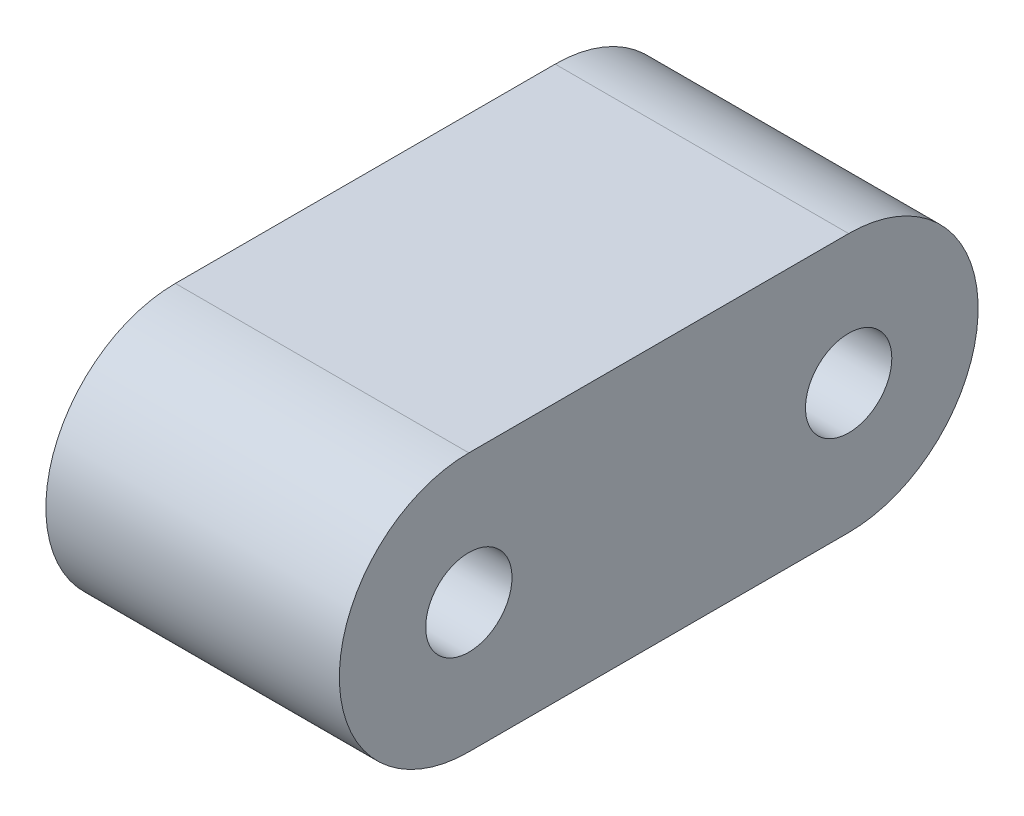
ISO-10303-21;
HEADER;
FILE_DESCRIPTION(('STEP AP214'),'2;1');
FILE_NAME('part.step','',(''),(''),'','','');
FILE_SCHEMA(('AUTOMOTIVE_DESIGN { 1 0 10303 214 1 1 1 1 }'));
ENDSEC;
DATA;
#1=APPLICATION_CONTEXT('core data for automotive mechanical design processes');
#2=APPLICATION_PROTOCOL_DEFINITION('international standard','automotive_design',2000,#1);
#3=PRODUCT_CONTEXT('',#1,'mechanical');
#4=PRODUCT('Part','Part','',(#3));
#5=PRODUCT_RELATED_PRODUCT_CATEGORY('part','',(#4));
#6=PRODUCT_DEFINITION_FORMATION('','',#4);
#7=PRODUCT_DEFINITION_CONTEXT('part definition',#1,'design');
#8=PRODUCT_DEFINITION('design','',#6,#7);
#9=PRODUCT_DEFINITION_SHAPE('','',#8);
#10=(LENGTH_UNIT() NAMED_UNIT(*) SI_UNIT(.MILLI.,.METRE.));
#11=(NAMED_UNIT(*) PLANE_ANGLE_UNIT() SI_UNIT($,.RADIAN.));
#12=(NAMED_UNIT(*) SI_UNIT($,.STERADIAN.) SOLID_ANGLE_UNIT());
#13=UNCERTAINTY_MEASURE_WITH_UNIT(LENGTH_MEASURE(1.E-05),#10,'distance_accuracy_value','');
#14=(GEOMETRIC_REPRESENTATION_CONTEXT(3) GLOBAL_UNCERTAINTY_ASSIGNED_CONTEXT((#13)) GLOBAL_UNIT_ASSIGNED_CONTEXT((#10,
#11,#12)) REPRESENTATION_CONTEXT('',''));
#15=CARTESIAN_POINT('',(0.,0.,0.));
#16=DIRECTION('',(0.,0.,1.));
#17=DIRECTION('',(1.,0.,0.));
#18=AXIS2_PLACEMENT_3D('',#15,#16,#17);
#19=CARTESIAN_POINT('',(8.5,0.,11.));
#20=DIRECTION('',(1.,0.,0.));
#21=DIRECTION('',(0.,0.,-1.));
#22=AXIS2_PLACEMENT_3D('',#19,#20,#21);
#23=PLANE('',#22);
#24=CARTESIAN_POINT('',(8.5,0.,11.));
#25=DIRECTION('',(1.,0.,0.));
#26=DIRECTION('',(0.,0.,-1.));
#27=AXIS2_PLACEMENT_3D('',#24,#25,#26);
#28=CIRCLE('',#27,2.5);
#29=CARTESIAN_POINT('',(8.5,0.,8.5));
#30=VERTEX_POINT('',#29);
#31=EDGE_CURVE('E102',#30,#30,#28,.T.);
#32=ORIENTED_EDGE('',*,*,#31,.F.);
#33=EDGE_LOOP('',(#32));
#34=FACE_BOUND('',#33,.T.);
#35=CARTESIAN_POINT('',(8.5,0.,11.));
#36=DIRECTION('',(1.,0.,0.));
#37=DIRECTION('',(0.,0.,-1.));
#38=AXIS2_PLACEMENT_3D('',#35,#36,#37);
#39=CIRCLE('',#38,7.49999999999999);
#40=CARTESIAN_POINT('',(8.5,7.49999999999999,11.));
#41=VERTEX_POINT('',#40);
#42=CARTESIAN_POINT('',(8.5,-7.5,11.));
#43=VERTEX_POINT('',#42);
#44=EDGE_CURVE('E87',#41,#43,#39,.T.);
#45=ORIENTED_EDGE('',*,*,#44,.T.);
#46=DIRECTION('',(0.,0.,-1.));
#47=VECTOR('',#46,1.);
#48=CARTESIAN_POINT('',(8.5,-7.5,11.));
#49=LINE('',#48,#47);
#50=CARTESIAN_POINT('',(8.5,-7.49999999999999,-11.));
#51=VERTEX_POINT('',#50);
#52=EDGE_CURVE('E82',#43,#51,#49,.T.);
#53=ORIENTED_EDGE('',*,*,#52,.T.);
#54=CARTESIAN_POINT('',(8.5,0.,-11.));
#55=DIRECTION('',(1.,0.,0.));
#56=DIRECTION('',(0.,0.,-1.));
#57=AXIS2_PLACEMENT_3D('',#54,#55,#56);
#58=CIRCLE('',#57,7.49999999999999);
#59=CARTESIAN_POINT('',(8.5,7.49999999999999,-11.));
#60=VERTEX_POINT('',#59);
#61=EDGE_CURVE('E85',#51,#60,#58,.T.);
#62=ORIENTED_EDGE('',*,*,#61,.T.);
#63=DIRECTION('',(0.,0.,1.));
#64=VECTOR('',#63,1.);
#65=CARTESIAN_POINT('',(8.5,7.49999999999999,11.));
#66=LINE('',#65,#64);
#67=EDGE_CURVE('E52',#60,#41,#66,.T.);
#68=ORIENTED_EDGE('',*,*,#67,.T.);
#69=EDGE_LOOP('',(#45,#53,#62,#68));
#70=FACE_BOUND('',#69,.T.);
#71=CARTESIAN_POINT('',(8.5,0.,-11.));
#72=DIRECTION('',(1.,0.,0.));
#73=DIRECTION('',(0.,0.,-1.));
#74=AXIS2_PLACEMENT_3D('',#71,#72,#73);
#75=CIRCLE('',#74,2.5);
#76=CARTESIAN_POINT('',(8.5,0.,-13.5));
#77=VERTEX_POINT('',#76);
#78=EDGE_CURVE('E117',#77,#77,#75,.T.);
#79=ORIENTED_EDGE('',*,*,#78,.F.);
#80=EDGE_LOOP('',(#79));
#81=FACE_BOUND('',#80,.T.);
#82=ADVANCED_FACE('F35',(#34,#70,#81),#23,.T.);
#83=CARTESIAN_POINT('',(-8.5,0.,11.));
#84=DIRECTION('',(1.,0.,0.));
#85=DIRECTION('',(0.,0.,-1.));
#86=AXIS2_PLACEMENT_3D('',#83,#84,#85);
#87=PLANE('',#86);
#88=CARTESIAN_POINT('',(-8.5,0.,11.));
#89=DIRECTION('',(1.,0.,0.));
#90=DIRECTION('',(0.,0.,-1.));
#91=AXIS2_PLACEMENT_3D('',#88,#89,#90);
#92=CIRCLE('',#91,7.49999999999999);
#93=CARTESIAN_POINT('',(-8.5,7.49999999999999,11.));
#94=VERTEX_POINT('',#93);
#95=CARTESIAN_POINT('',(-8.5,-7.5,11.));
#96=VERTEX_POINT('',#95);
#97=EDGE_CURVE('E99',#94,#96,#92,.T.);
#98=ORIENTED_EDGE('',*,*,#97,.F.);
#99=DIRECTION('',(0.,0.,1.));
#100=VECTOR('',#99,1.);
#101=CARTESIAN_POINT('',(-8.5,7.49999999999999,11.));
#102=LINE('',#101,#100);
#103=CARTESIAN_POINT('',(-8.5,7.49999999999999,-11.));
#104=VERTEX_POINT('',#103);
#105=EDGE_CURVE('E75',#104,#94,#102,.T.);
#106=ORIENTED_EDGE('',*,*,#105,.F.);
#107=CARTESIAN_POINT('',(-8.5,0.,-11.));
#108=DIRECTION('',(1.,0.,0.));
#109=DIRECTION('',(0.,0.,-1.));
#110=AXIS2_PLACEMENT_3D('',#107,#108,#109);
#111=CIRCLE('',#110,7.49999999999999);
#112=CARTESIAN_POINT('',(-8.5,-7.49999999999999,-11.));
#113=VERTEX_POINT('',#112);
#114=EDGE_CURVE('E69',#113,#104,#111,.T.);
#115=ORIENTED_EDGE('',*,*,#114,.F.);
#116=DIRECTION('',(0.,0.,-1.));
#117=VECTOR('',#116,1.);
#118=CARTESIAN_POINT('',(-8.5,-7.5,11.));
#119=LINE('',#118,#117);
#120=EDGE_CURVE('E91',#96,#113,#119,.T.);
#121=ORIENTED_EDGE('',*,*,#120,.F.);
#122=EDGE_LOOP('',(#98,#106,#115,#121));
#123=FACE_BOUND('',#122,.T.);
#124=CARTESIAN_POINT('',(-8.5,0.,11.));
#125=DIRECTION('',(1.,0.,0.));
#126=DIRECTION('',(0.,0.,-1.));
#127=AXIS2_PLACEMENT_3D('',#124,#125,#126);
#128=CIRCLE('',#127,2.5);
#129=CARTESIAN_POINT('',(-8.5,0.,8.5));
#130=VERTEX_POINT('',#129);
#131=EDGE_CURVE('E114',#130,#130,#128,.T.);
#132=ORIENTED_EDGE('',*,*,#131,.T.);
#133=EDGE_LOOP('',(#132));
#134=FACE_BOUND('',#133,.T.);
#135=CARTESIAN_POINT('',(-8.5,0.,-11.));
#136=DIRECTION('',(1.,0.,0.));
#137=DIRECTION('',(0.,0.,-1.));
#138=AXIS2_PLACEMENT_3D('',#135,#136,#137);
#139=CIRCLE('',#138,2.5);
#140=CARTESIAN_POINT('',(-8.5,0.,-13.5));
#141=VERTEX_POINT('',#140);
#142=EDGE_CURVE('E120',#141,#141,#139,.T.);
#143=ORIENTED_EDGE('',*,*,#142,.T.);
#144=EDGE_LOOP('',(#143));
#145=FACE_BOUND('',#144,.T.);
#146=ADVANCED_FACE('F110',(#123,#134,#145),#87,.F.);
#147=CARTESIAN_POINT('',(8.5,0.,11.));
#148=DIRECTION('',(-1.,0.,0.));
#149=DIRECTION('',(0.,0.,1.));
#150=AXIS2_PLACEMENT_3D('',#147,#148,#149);
#151=CYLINDRICAL_SURFACE('',#150,7.49999999999999);
#152=ORIENTED_EDGE('',*,*,#97,.T.);
#153=DIRECTION('',(-1.,0.,0.));
#154=VECTOR('',#153,1.);
#155=CARTESIAN_POINT('',(8.5,-7.5,11.));
#156=LINE('',#155,#154);
#157=EDGE_CURVE('E11',#43,#96,#156,.T.);
#158=ORIENTED_EDGE('',*,*,#157,.F.);
#159=ORIENTED_EDGE('',*,*,#44,.F.);
#160=DIRECTION('',(-1.,0.,0.));
#161=VECTOR('',#160,1.);
#162=CARTESIAN_POINT('',(8.5,7.49999999999999,11.));
#163=LINE('',#162,#161);
#164=EDGE_CURVE('E95',#41,#94,#163,.T.);
#165=ORIENTED_EDGE('',*,*,#164,.T.);
#166=EDGE_LOOP('',(#152,#158,#159,#165));
#167=FACE_BOUND('',#166,.T.);
#168=ADVANCED_FACE('F37',(#167),#151,.T.);
#169=CARTESIAN_POINT('',(8.5,-7.5,11.));
#170=DIRECTION('',(0.,1.,0.));
#171=DIRECTION('',(0.,0.,1.));
#172=AXIS2_PLACEMENT_3D('',#169,#170,#171);
#173=PLANE('',#172);
#174=ORIENTED_EDGE('',*,*,#120,.T.);
#175=DIRECTION('',(-1.,0.,0.));
#176=VECTOR('',#175,1.);
#177=CARTESIAN_POINT('',(8.5,-7.49999999999999,-11.));
#178=LINE('',#177,#176);
#179=EDGE_CURVE('E44',#51,#113,#178,.T.);
#180=ORIENTED_EDGE('',*,*,#179,.F.);
#181=ORIENTED_EDGE('',*,*,#52,.F.);
#182=ORIENTED_EDGE('',*,*,#157,.T.);
#183=EDGE_LOOP('',(#174,#180,#181,#182));
#184=FACE_BOUND('',#183,.T.);
#185=ADVANCED_FACE('F90',(#184),#173,.F.);
#186=CARTESIAN_POINT('',(8.5,0.,-11.));
#187=DIRECTION('',(-1.,0.,0.));
#188=DIRECTION('',(0.,0.,1.));
#189=AXIS2_PLACEMENT_3D('',#186,#187,#188);
#190=CYLINDRICAL_SURFACE('',#189,7.49999999999999);
#191=ORIENTED_EDGE('',*,*,#114,.T.);
#192=DIRECTION('',(-1.,0.,0.));
#193=VECTOR('',#192,1.);
#194=CARTESIAN_POINT('',(8.5,7.49999999999999,-11.));
#195=LINE('',#194,#193);
#196=EDGE_CURVE('E92',#60,#104,#195,.T.);
#197=ORIENTED_EDGE('',*,*,#196,.F.);
#198=ORIENTED_EDGE('',*,*,#61,.F.);
#199=ORIENTED_EDGE('',*,*,#179,.T.);
#200=EDGE_LOOP('',(#191,#197,#198,#199));
#201=FACE_BOUND('',#200,.T.);
#202=ADVANCED_FACE('F93',(#201),#190,.T.);
#203=CARTESIAN_POINT('',(8.5,7.49999999999999,11.));
#204=DIRECTION('',(0.,-1.,0.));
#205=DIRECTION('',(0.,0.,-1.));
#206=AXIS2_PLACEMENT_3D('',#203,#204,#205);
#207=PLANE('',#206);
#208=ORIENTED_EDGE('',*,*,#105,.T.);
#209=ORIENTED_EDGE('',*,*,#164,.F.);
#210=ORIENTED_EDGE('',*,*,#67,.F.);
#211=ORIENTED_EDGE('',*,*,#196,.T.);
#212=EDGE_LOOP('',(#208,#209,#210,#211));
#213=FACE_BOUND('',#212,.T.);
#214=ADVANCED_FACE('F107',(#213),#207,.F.);
#215=CARTESIAN_POINT('',(8.5,0.,11.));
#216=DIRECTION('',(-1.,0.,0.));
#217=DIRECTION('',(0.,0.,1.));
#218=AXIS2_PLACEMENT_3D('',#215,#216,#217);
#219=CYLINDRICAL_SURFACE('',#218,2.5);
#220=ORIENTED_EDGE('',*,*,#31,.T.);
#221=EDGE_LOOP('',(#220));
#222=FACE_BOUND('',#221,.T.);
#223=ORIENTED_EDGE('',*,*,#131,.F.);
#224=EDGE_LOOP('',(#223));
#225=FACE_BOUND('',#224,.T.);
#226=ADVANCED_FACE('F137',(#222,#225),#219,.F.);
#227=CARTESIAN_POINT('',(8.5,0.,-11.));
#228=DIRECTION('',(-1.,0.,0.));
#229=DIRECTION('',(0.,0.,1.));
#230=AXIS2_PLACEMENT_3D('',#227,#228,#229);
#231=CYLINDRICAL_SURFACE('',#230,2.5);
#232=ORIENTED_EDGE('',*,*,#78,.T.);
#233=EDGE_LOOP('',(#232));
#234=FACE_BOUND('',#233,.T.);
#235=ORIENTED_EDGE('',*,*,#142,.F.);
#236=EDGE_LOOP('',(#235));
#237=FACE_BOUND('',#236,.T.);
#238=ADVANCED_FACE('F126',(#234,#237),#231,.F.);
#239=CLOSED_SHELL('',(#82,#146,#168,#185,#202,#214,#226,#238));
#240=MANIFOLD_SOLID_BREP('B2',#239);
#241=ADVANCED_BREP_SHAPE_REPRESENTATION('',(#18,#240),#14);
#242=SHAPE_DEFINITION_REPRESENTATION(#9,#241);
ENDSEC;
END-ISO-10303-21;
